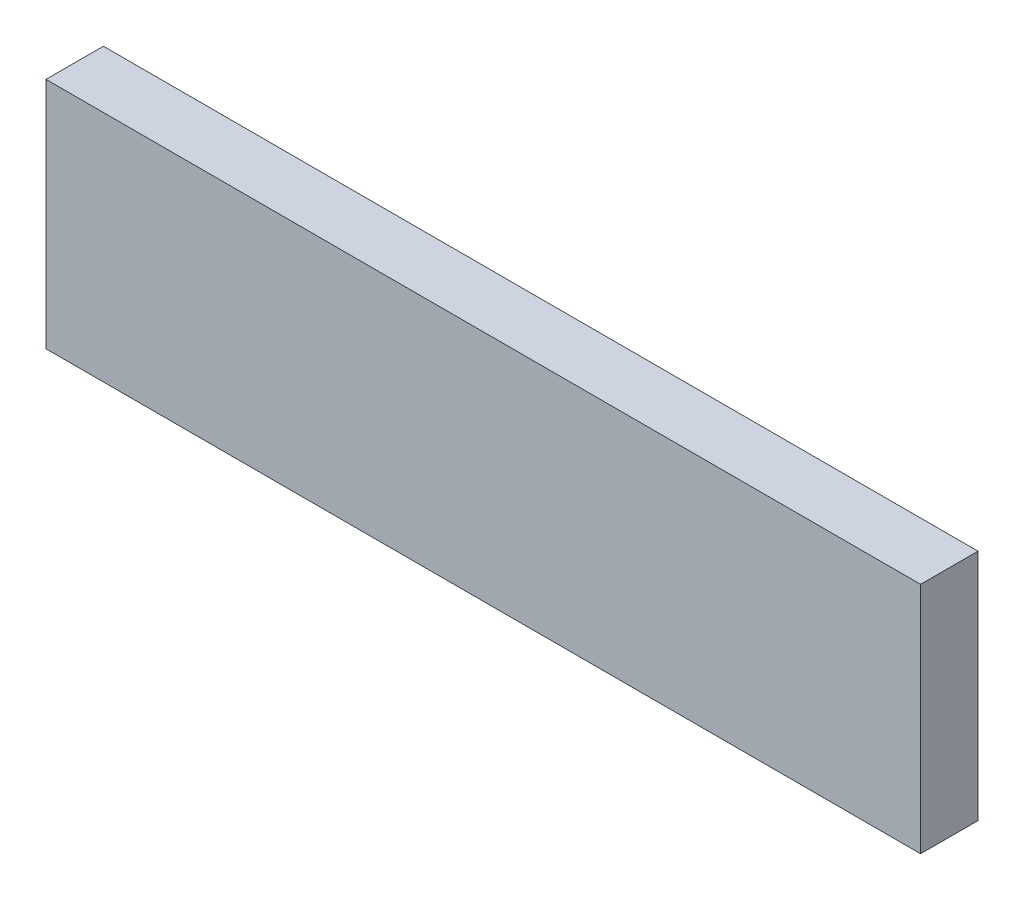
ISO-10303-21;
HEADER;
FILE_DESCRIPTION(('STEP AP214'),'2;1');
FILE_NAME('part.step','',(''),(''),'','','');
FILE_SCHEMA(('AUTOMOTIVE_DESIGN { 1 0 10303 214 1 1 1 1 }'));
ENDSEC;
DATA;
#1=APPLICATION_CONTEXT('core data for automotive mechanical design processes');
#2=APPLICATION_PROTOCOL_DEFINITION('international standard','automotive_design',2000,#1);
#3=PRODUCT_CONTEXT('',#1,'mechanical');
#4=PRODUCT('Part','Part','',(#3));
#5=PRODUCT_RELATED_PRODUCT_CATEGORY('part','',(#4));
#6=PRODUCT_DEFINITION_FORMATION('','',#4);
#7=PRODUCT_DEFINITION_CONTEXT('part definition',#1,'design');
#8=PRODUCT_DEFINITION('design','',#6,#7);
#9=PRODUCT_DEFINITION_SHAPE('','',#8);
#10=(LENGTH_UNIT() NAMED_UNIT(*) SI_UNIT(.MILLI.,.METRE.));
#11=(NAMED_UNIT(*) PLANE_ANGLE_UNIT() SI_UNIT($,.RADIAN.));
#12=(NAMED_UNIT(*) SI_UNIT($,.STERADIAN.) SOLID_ANGLE_UNIT());
#13=UNCERTAINTY_MEASURE_WITH_UNIT(LENGTH_MEASURE(1.E-05),#10,'distance_accuracy_value','');
#14=(GEOMETRIC_REPRESENTATION_CONTEXT(3) GLOBAL_UNCERTAINTY_ASSIGNED_CONTEXT((#13)) GLOBAL_UNIT_ASSIGNED_CONTEXT((#10,
#11,#12)) REPRESENTATION_CONTEXT('',''));
#15=CARTESIAN_POINT('',(0.,0.,0.));
#16=DIRECTION('',(0.,0.,1.));
#17=DIRECTION('',(1.,0.,0.));
#18=AXIS2_PLACEMENT_3D('',#15,#16,#17);
#19=CARTESIAN_POINT('',(70.,-33.2917866648596,20.5472745822181));
#20=DIRECTION('',(0.,0.,-1.));
#21=DIRECTION('',(-1.,0.,0.));
#22=AXIS2_PLACEMENT_3D('',#19,#20,#21);
#23=PLANE('',#22);
#24=DIRECTION('',(0.,-1.,0.));
#25=VECTOR('',#24,1.);
#26=CARTESIAN_POINT('',(35.,-33.2917866648596,20.5472745822181));
#27=LINE('',#26,#25);
#28=CARTESIAN_POINT('',(35.,-33.2917866648596,20.5472745822181));
#29=VERTEX_POINT('',#28);
#30=CARTESIAN_POINT('',(35.,-42.6300625429086,20.5472745822181));
#31=VERTEX_POINT('',#30);
#32=EDGE_CURVE('E111',#29,#31,#27,.T.);
#33=ORIENTED_EDGE('',*,*,#32,.T.);
#34=DIRECTION('',(-1.,0.,0.));
#35=VECTOR('',#34,1.);
#36=CARTESIAN_POINT('',(70.,-42.6300625429086,20.5472745822181));
#37=LINE('',#36,#35);
#38=CARTESIAN_POINT('',(70.,-42.6300625429086,20.5472745822181));
#39=VERTEX_POINT('',#38);
#40=EDGE_CURVE('E11',#39,#31,#37,.T.);
#41=ORIENTED_EDGE('',*,*,#40,.F.);
#42=DIRECTION('',(0.,-1.,0.));
#43=VECTOR('',#42,1.);
#44=CARTESIAN_POINT('',(70.,-33.2917866648596,20.5472745822181));
#45=LINE('',#44,#43);
#46=CARTESIAN_POINT('',(70.,-33.2917866648596,20.5472745822181));
#47=VERTEX_POINT('',#46);
#48=EDGE_CURVE('E95',#47,#39,#45,.T.);
#49=ORIENTED_EDGE('',*,*,#48,.F.);
#50=DIRECTION('',(-1.,0.,0.));
#51=VECTOR('',#50,1.);
#52=CARTESIAN_POINT('',(70.,-33.2917866648596,20.5472745822181));
#53=LINE('',#52,#51);
#54=EDGE_CURVE('E107',#47,#29,#53,.T.);
#55=ORIENTED_EDGE('',*,*,#54,.T.);
#56=EDGE_LOOP('',(#33,#41,#49,#55));
#57=FACE_BOUND('',#56,.T.);
#58=ADVANCED_FACE('F43',(#57),#23,.F.);
#59=CARTESIAN_POINT('',(70.,-42.6300625429086,20.5472745822181));
#60=DIRECTION('',(0.,1.,0.));
#61=DIRECTION('',(0.,0.,1.));
#62=AXIS2_PLACEMENT_3D('',#59,#60,#61);
#63=PLANE('',#62);
#64=DIRECTION('',(0.,0.,-1.));
#65=VECTOR('',#64,1.);
#66=CARTESIAN_POINT('',(35.,-42.6300625429086,20.5472745822181));
#67=LINE('',#66,#65);
#68=CARTESIAN_POINT('',(35.,-42.6300625429086,18.2503498770127));
#69=VERTEX_POINT('',#68);
#70=EDGE_CURVE('E100',#31,#69,#67,.T.);
#71=ORIENTED_EDGE('',*,*,#70,.T.);
#72=DIRECTION('',(-1.,0.,0.));
#73=VECTOR('',#72,1.);
#74=CARTESIAN_POINT('',(70.,-42.6300625429086,18.2503498770127));
#75=LINE('',#74,#73);
#76=CARTESIAN_POINT('',(70.,-42.6300625429086,18.2503498770127));
#77=VERTEX_POINT('',#76);
#78=EDGE_CURVE('E52',#77,#69,#75,.T.);
#79=ORIENTED_EDGE('',*,*,#78,.F.);
#80=DIRECTION('',(0.,0.,-1.));
#81=VECTOR('',#80,1.);
#82=CARTESIAN_POINT('',(70.,-42.6300625429086,20.5472745822181));
#83=LINE('',#82,#81);
#84=EDGE_CURVE('E90',#39,#77,#83,.T.);
#85=ORIENTED_EDGE('',*,*,#84,.F.);
#86=ORIENTED_EDGE('',*,*,#40,.T.);
#87=EDGE_LOOP('',(#71,#79,#85,#86));
#88=FACE_BOUND('',#87,.T.);
#89=ADVANCED_FACE('F99',(#88),#63,.F.);
#90=CARTESIAN_POINT('',(70.,-33.2917866648596,18.2503498770127));
#91=DIRECTION('',(0.,0.,1.));
#92=DIRECTION('',(1.,0.,0.));
#93=AXIS2_PLACEMENT_3D('',#90,#91,#92);
#94=PLANE('',#93);
#95=DIRECTION('',(0.,1.,0.));
#96=VECTOR('',#95,1.);
#97=CARTESIAN_POINT('',(35.,-33.2917866648596,18.2503498770127));
#98=LINE('',#97,#96);
#99=CARTESIAN_POINT('',(35.,-33.2917866648596,18.2503498770127));
#100=VERTEX_POINT('',#99);
#101=EDGE_CURVE('E77',#69,#100,#98,.T.);
#102=ORIENTED_EDGE('',*,*,#101,.T.);
#103=DIRECTION('',(-1.,0.,0.));
#104=VECTOR('',#103,1.);
#105=CARTESIAN_POINT('',(70.,-33.2917866648596,18.2503498770127));
#106=LINE('',#105,#104);
#107=CARTESIAN_POINT('',(70.,-33.2917866648596,18.2503498770127));
#108=VERTEX_POINT('',#107);
#109=EDGE_CURVE('E102',#108,#100,#106,.T.);
#110=ORIENTED_EDGE('',*,*,#109,.F.);
#111=DIRECTION('',(0.,1.,0.));
#112=VECTOR('',#111,1.);
#113=CARTESIAN_POINT('',(70.,-33.2917866648596,18.2503498770127));
#114=LINE('',#113,#112);
#115=EDGE_CURVE('E93',#77,#108,#114,.T.);
#116=ORIENTED_EDGE('',*,*,#115,.F.);
#117=ORIENTED_EDGE('',*,*,#78,.T.);
#118=EDGE_LOOP('',(#102,#110,#116,#117));
#119=FACE_BOUND('',#118,.T.);
#120=ADVANCED_FACE('F103',(#119),#94,.F.);
#121=CARTESIAN_POINT('',(70.,-33.2917866648596,20.5472745822181));
#122=DIRECTION('',(0.,-1.,0.));
#123=DIRECTION('',(0.,0.,-1.));
#124=AXIS2_PLACEMENT_3D('',#121,#122,#123);
#125=PLANE('',#124);
#126=DIRECTION('',(0.,0.,1.));
#127=VECTOR('',#126,1.);
#128=CARTESIAN_POINT('',(35.,-33.2917866648596,20.5472745822181));
#129=LINE('',#128,#127);
#130=EDGE_CURVE('E83',#100,#29,#129,.T.);
#131=ORIENTED_EDGE('',*,*,#130,.T.);
#132=ORIENTED_EDGE('',*,*,#54,.F.);
#133=DIRECTION('',(0.,0.,1.));
#134=VECTOR('',#133,1.);
#135=CARTESIAN_POINT('',(70.,-33.2917866648596,20.5472745822181));
#136=LINE('',#135,#134);
#137=EDGE_CURVE('E60',#108,#47,#136,.T.);
#138=ORIENTED_EDGE('',*,*,#137,.F.);
#139=ORIENTED_EDGE('',*,*,#109,.T.);
#140=EDGE_LOOP('',(#131,#132,#138,#139));
#141=FACE_BOUND('',#140,.T.);
#142=ADVANCED_FACE('F124',(#141),#125,.F.);
#143=CARTESIAN_POINT('',(70.,0.,0.));
#144=DIRECTION('',(1.,0.,0.));
#145=DIRECTION('',(0.,0.,-1.));
#146=AXIS2_PLACEMENT_3D('',#143,#144,#145);
#147=PLANE('',#146);
#148=ORIENTED_EDGE('',*,*,#48,.T.);
#149=ORIENTED_EDGE('',*,*,#84,.T.);
#150=ORIENTED_EDGE('',*,*,#115,.T.);
#151=ORIENTED_EDGE('',*,*,#137,.T.);
#152=EDGE_LOOP('',(#148,#149,#150,#151));
#153=FACE_BOUND('',#152,.T.);
#154=ADVANCED_FACE('F91',(#153),#147,.T.);
#155=CARTESIAN_POINT('',(35.,0.,0.));
#156=DIRECTION('',(1.,0.,0.));
#157=DIRECTION('',(0.,0.,-1.));
#158=AXIS2_PLACEMENT_3D('',#155,#156,#157);
#159=PLANE('',#158);
#160=ORIENTED_EDGE('',*,*,#32,.F.);
#161=ORIENTED_EDGE('',*,*,#130,.F.);
#162=ORIENTED_EDGE('',*,*,#101,.F.);
#163=ORIENTED_EDGE('',*,*,#70,.F.);
#164=EDGE_LOOP('',(#160,#161,#162,#163));
#165=FACE_BOUND('',#164,.T.);
#166=ADVANCED_FACE('F127',(#165),#159,.F.);
#167=CLOSED_SHELL('',(#58,#89,#120,#142,#154,#166));
#168=MANIFOLD_SOLID_BREP('B2',#167);
#169=ADVANCED_BREP_SHAPE_REPRESENTATION('',(#18,#168),#14);
#170=SHAPE_DEFINITION_REPRESENTATION(#9,#169);
ENDSEC;
END-ISO-10303-21;
